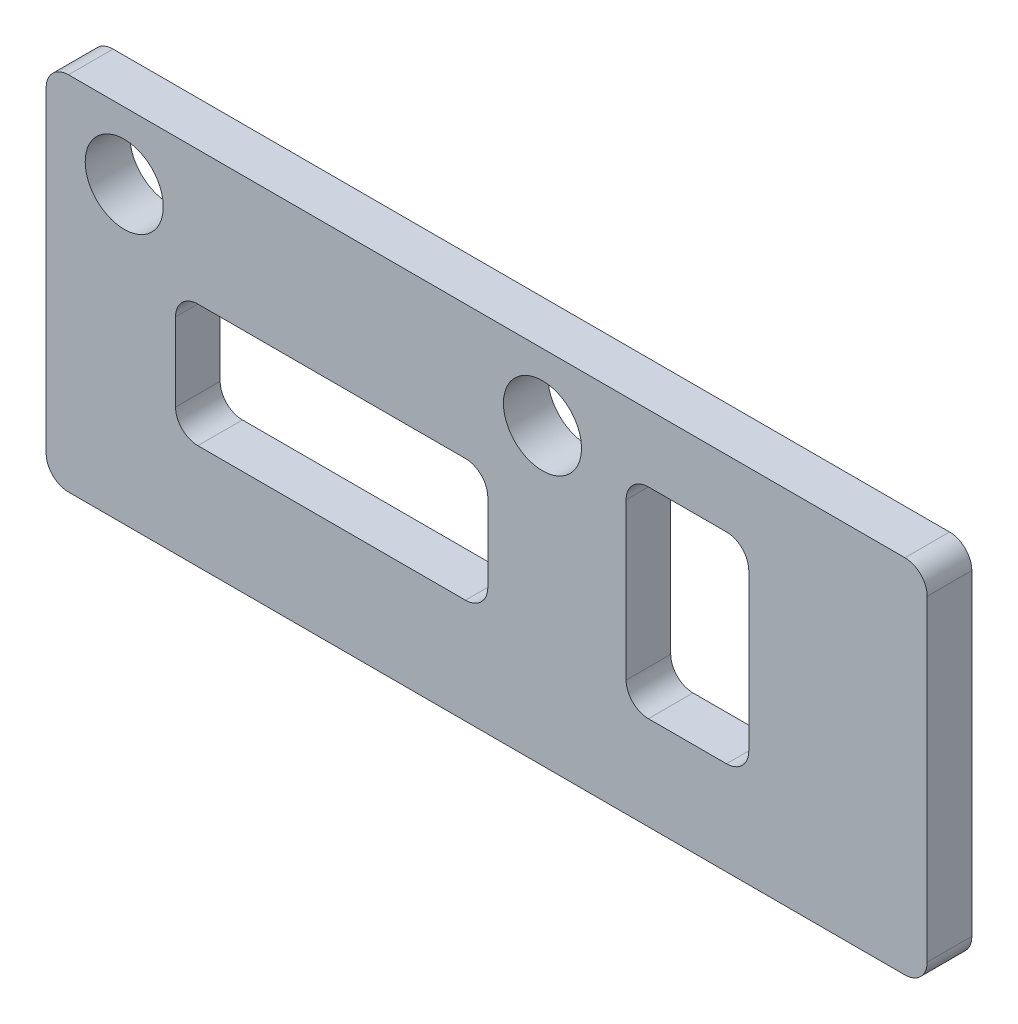
ISO-10303-21;
HEADER;
FILE_DESCRIPTION(('STEP AP214'),'2;1');
FILE_NAME('part.step','',(''),(''),'','','');
FILE_SCHEMA(('AUTOMOTIVE_DESIGN { 1 0 10303 214 1 1 1 1 }'));
ENDSEC;
DATA;
#1=APPLICATION_CONTEXT('core data for automotive mechanical design processes');
#2=APPLICATION_PROTOCOL_DEFINITION('international standard','automotive_design',2000,#1);
#3=PRODUCT_CONTEXT('',#1,'mechanical');
#4=PRODUCT('Part','Part','',(#3));
#5=PRODUCT_RELATED_PRODUCT_CATEGORY('part','',(#4));
#6=PRODUCT_DEFINITION_FORMATION('','',#4);
#7=PRODUCT_DEFINITION_CONTEXT('part definition',#1,'design');
#8=PRODUCT_DEFINITION('design','',#6,#7);
#9=PRODUCT_DEFINITION_SHAPE('','',#8);
#10=(LENGTH_UNIT() NAMED_UNIT(*) SI_UNIT(.MILLI.,.METRE.));
#11=(NAMED_UNIT(*) PLANE_ANGLE_UNIT() SI_UNIT($,.RADIAN.));
#12=(NAMED_UNIT(*) SI_UNIT($,.STERADIAN.) SOLID_ANGLE_UNIT());
#13=UNCERTAINTY_MEASURE_WITH_UNIT(LENGTH_MEASURE(1.E-05),#10,'distance_accuracy_value','');
#14=(GEOMETRIC_REPRESENTATION_CONTEXT(3) GLOBAL_UNCERTAINTY_ASSIGNED_CONTEXT((#13)) GLOBAL_UNIT_ASSIGNED_CONTEXT((#10,
#11,#12)) REPRESENTATION_CONTEXT('',''));
#15=CARTESIAN_POINT('',(0.,0.,0.));
#16=DIRECTION('',(0.,0.,1.));
#17=DIRECTION('',(1.,0.,0.));
#18=AXIS2_PLACEMENT_3D('',#15,#16,#17);
#19=CARTESIAN_POINT('',(-18.75,7.10000000000003,-2.));
#20=DIRECTION('',(0.,0.,1.));
#21=DIRECTION('',(1.,0.,0.));
#22=AXIS2_PLACEMENT_3D('',#19,#20,#21);
#23=CYLINDRICAL_SURFACE('',#22,0.99999999999999);
#24=CARTESIAN_POINT('',(-18.75,7.10000000000003,0.));
#25=DIRECTION('',(0.,0.,1.));
#26=DIRECTION('',(1.,0.,0.));
#27=AXIS2_PLACEMENT_3D('',#24,#25,#26);
#28=CIRCLE('',#27,0.99999999999999);
#29=CARTESIAN_POINT('',(-18.75,8.10000000000002,0.));
#30=VERTEX_POINT('',#29);
#31=CARTESIAN_POINT('',(-19.75,7.10000000000003,0.));
#32=VERTEX_POINT('',#31);
#33=EDGE_CURVE('E316',#30,#32,#28,.T.);
#34=ORIENTED_EDGE('',*,*,#33,.F.);
#35=DIRECTION('',(0.,0.,1.));
#36=VECTOR('',#35,1.);
#37=CARTESIAN_POINT('',(-18.75,8.10000000000002,-2.));
#38=LINE('',#37,#36);
#39=CARTESIAN_POINT('',(-18.75,8.10000000000002,-2.));
#40=VERTEX_POINT('',#39);
#41=EDGE_CURVE('E11',#40,#30,#38,.T.);
#42=ORIENTED_EDGE('',*,*,#41,.F.);
#43=CARTESIAN_POINT('',(-18.75,7.10000000000003,-2.));
#44=DIRECTION('',(0.,0.,1.));
#45=DIRECTION('',(1.,0.,0.));
#46=AXIS2_PLACEMENT_3D('',#43,#44,#45);
#47=CIRCLE('',#46,0.99999999999999);
#48=CARTESIAN_POINT('',(-19.75,7.10000000000003,-2.));
#49=VERTEX_POINT('',#48);
#50=EDGE_CURVE('E331',#40,#49,#47,.T.);
#51=ORIENTED_EDGE('',*,*,#50,.T.);
#52=DIRECTION('',(0.,0.,1.));
#53=VECTOR('',#52,1.);
#54=CARTESIAN_POINT('',(-19.75,7.10000000000003,-2.));
#55=LINE('',#54,#53);
#56=EDGE_CURVE('E36',#49,#32,#55,.T.);
#57=ORIENTED_EDGE('',*,*,#56,.T.);
#58=EDGE_LOOP('',(#34,#42,#51,#57));
#59=FACE_BOUND('',#58,.T.);
#60=ADVANCED_FACE('F33',(#59),#23,.T.);
#61=CARTESIAN_POINT('',(18.75,8.10000000000002,-2.));
#62=DIRECTION('',(0.,1.,0.));
#63=DIRECTION('',(0.,0.,1.));
#64=AXIS2_PLACEMENT_3D('',#61,#62,#63);
#65=PLANE('',#64);
#66=DIRECTION('',(-1.,0.,0.));
#67=VECTOR('',#66,1.);
#68=CARTESIAN_POINT('',(18.75,8.10000000000002,0.));
#69=LINE('',#68,#67);
#70=CARTESIAN_POINT('',(18.75,8.10000000000002,0.));
#71=VERTEX_POINT('',#70);
#72=EDGE_CURVE('E335',#71,#30,#69,.T.);
#73=ORIENTED_EDGE('',*,*,#72,.F.);
#74=DIRECTION('',(0.,0.,1.));
#75=VECTOR('',#74,1.);
#76=CARTESIAN_POINT('',(18.75,8.10000000000002,-2.));
#77=LINE('',#76,#75);
#78=CARTESIAN_POINT('',(18.75,8.10000000000002,-2.));
#79=VERTEX_POINT('',#78);
#80=EDGE_CURVE('E41',#79,#71,#77,.T.);
#81=ORIENTED_EDGE('',*,*,#80,.F.);
#82=DIRECTION('',(-1.,0.,0.));
#83=VECTOR('',#82,1.);
#84=CARTESIAN_POINT('',(18.75,8.10000000000002,-2.));
#85=LINE('',#84,#83);
#86=EDGE_CURVE('E353',#79,#40,#85,.T.);
#87=ORIENTED_EDGE('',*,*,#86,.T.);
#88=ORIENTED_EDGE('',*,*,#41,.T.);
#89=EDGE_LOOP('',(#73,#81,#87,#88));
#90=FACE_BOUND('',#89,.T.);
#91=ADVANCED_FACE('F400',(#90),#65,.T.);
#92=CARTESIAN_POINT('',(18.75,7.10000000000003,-2.));
#93=DIRECTION('',(0.,0.,1.));
#94=DIRECTION('',(1.,0.,0.));
#95=AXIS2_PLACEMENT_3D('',#92,#93,#94);
#96=CYLINDRICAL_SURFACE('',#95,0.99999999999999);
#97=CARTESIAN_POINT('',(18.75,7.10000000000003,0.));
#98=DIRECTION('',(0.,0.,1.));
#99=DIRECTION('',(1.,0.,0.));
#100=AXIS2_PLACEMENT_3D('',#97,#98,#99);
#101=CIRCLE('',#100,0.99999999999999);
#102=CARTESIAN_POINT('',(19.75,7.10000000000003,0.));
#103=VERTEX_POINT('',#102);
#104=EDGE_CURVE('E373',#103,#71,#101,.T.);
#105=ORIENTED_EDGE('',*,*,#104,.F.);
#106=DIRECTION('',(0.,0.,1.));
#107=VECTOR('',#106,1.);
#108=CARTESIAN_POINT('',(19.75,7.10000000000003,-2.));
#109=LINE('',#108,#107);
#110=CARTESIAN_POINT('',(19.75,7.10000000000003,-2.));
#111=VERTEX_POINT('',#110);
#112=EDGE_CURVE('E379',#111,#103,#109,.T.);
#113=ORIENTED_EDGE('',*,*,#112,.F.);
#114=CARTESIAN_POINT('',(18.75,7.10000000000003,-2.));
#115=DIRECTION('',(0.,0.,1.));
#116=DIRECTION('',(1.,0.,0.));
#117=AXIS2_PLACEMENT_3D('',#114,#115,#116);
#118=CIRCLE('',#117,0.99999999999999);
#119=EDGE_CURVE('E350',#111,#79,#118,.T.);
#120=ORIENTED_EDGE('',*,*,#119,.T.);
#121=ORIENTED_EDGE('',*,*,#80,.T.);
#122=EDGE_LOOP('',(#105,#113,#120,#121));
#123=FACE_BOUND('',#122,.T.);
#124=ADVANCED_FACE('F420',(#123),#96,.T.);
#125=CARTESIAN_POINT('',(19.75,-7.10000000000003,-2.));
#126=DIRECTION('',(1.,0.,0.));
#127=DIRECTION('',(0.,0.,-1.));
#128=AXIS2_PLACEMENT_3D('',#125,#126,#127);
#129=PLANE('',#128);
#130=DIRECTION('',(0.,1.,0.));
#131=VECTOR('',#130,1.);
#132=CARTESIAN_POINT('',(19.75,-7.10000000000003,0.));
#133=LINE('',#132,#131);
#134=CARTESIAN_POINT('',(19.75,-7.10000000000003,0.));
#135=VERTEX_POINT('',#134);
#136=EDGE_CURVE('E370',#135,#103,#133,.T.);
#137=ORIENTED_EDGE('',*,*,#136,.F.);
#138=DIRECTION('',(0.,0.,1.));
#139=VECTOR('',#138,1.);
#140=CARTESIAN_POINT('',(19.75,-7.10000000000003,-2.));
#141=LINE('',#140,#139);
#142=CARTESIAN_POINT('',(19.75,-7.10000000000003,-2.));
#143=VERTEX_POINT('',#142);
#144=EDGE_CURVE('E381',#143,#135,#141,.T.);
#145=ORIENTED_EDGE('',*,*,#144,.F.);
#146=DIRECTION('',(0.,1.,0.));
#147=VECTOR('',#146,1.);
#148=CARTESIAN_POINT('',(19.75,-7.10000000000003,-2.));
#149=LINE('',#148,#147);
#150=EDGE_CURVE('E347',#143,#111,#149,.T.);
#151=ORIENTED_EDGE('',*,*,#150,.T.);
#152=ORIENTED_EDGE('',*,*,#112,.T.);
#153=EDGE_LOOP('',(#137,#145,#151,#152));
#154=FACE_BOUND('',#153,.T.);
#155=ADVANCED_FACE('F418',(#154),#129,.T.);
#156=CARTESIAN_POINT('',(18.75,-7.10000000000003,-2.));
#157=DIRECTION('',(0.,0.,1.));
#158=DIRECTION('',(1.,0.,0.));
#159=AXIS2_PLACEMENT_3D('',#156,#157,#158);
#160=CYLINDRICAL_SURFACE('',#159,0.99999999999999);
#161=CARTESIAN_POINT('',(18.75,-7.10000000000003,0.));
#162=DIRECTION('',(0.,0.,1.));
#163=DIRECTION('',(1.,0.,0.));
#164=AXIS2_PLACEMENT_3D('',#161,#162,#163);
#165=CIRCLE('',#164,0.99999999999999);
#166=CARTESIAN_POINT('',(18.75,-8.10000000000002,0.));
#167=VERTEX_POINT('',#166);
#168=EDGE_CURVE('E367',#167,#135,#165,.T.);
#169=ORIENTED_EDGE('',*,*,#168,.F.);
#170=DIRECTION('',(0.,0.,1.));
#171=VECTOR('',#170,1.);
#172=CARTESIAN_POINT('',(18.75,-8.10000000000002,-2.));
#173=LINE('',#172,#171);
#174=CARTESIAN_POINT('',(18.75,-8.10000000000002,-2.));
#175=VERTEX_POINT('',#174);
#176=EDGE_CURVE('E383',#175,#167,#173,.T.);
#177=ORIENTED_EDGE('',*,*,#176,.F.);
#178=CARTESIAN_POINT('',(18.75,-7.10000000000003,-2.));
#179=DIRECTION('',(0.,0.,1.));
#180=DIRECTION('',(1.,0.,0.));
#181=AXIS2_PLACEMENT_3D('',#178,#179,#180);
#182=CIRCLE('',#181,0.99999999999999);
#183=EDGE_CURVE('E344',#175,#143,#182,.T.);
#184=ORIENTED_EDGE('',*,*,#183,.T.);
#185=ORIENTED_EDGE('',*,*,#144,.T.);
#186=EDGE_LOOP('',(#169,#177,#184,#185));
#187=FACE_BOUND('',#186,.T.);
#188=ADVANCED_FACE('F414',(#187),#160,.T.);
#189=CARTESIAN_POINT('',(-18.75,-8.10000000000002,-2.));
#190=DIRECTION('',(0.,-1.,0.));
#191=DIRECTION('',(0.,0.,-1.));
#192=AXIS2_PLACEMENT_3D('',#189,#190,#191);
#193=PLANE('',#192);
#194=DIRECTION('',(1.,0.,0.));
#195=VECTOR('',#194,1.);
#196=CARTESIAN_POINT('',(-18.75,-8.10000000000002,0.));
#197=LINE('',#196,#195);
#198=CARTESIAN_POINT('',(-18.75,-8.10000000000002,0.));
#199=VERTEX_POINT('',#198);
#200=EDGE_CURVE('E364',#199,#167,#197,.T.);
#201=ORIENTED_EDGE('',*,*,#200,.F.);
#202=DIRECTION('',(0.,0.,1.));
#203=VECTOR('',#202,1.);
#204=CARTESIAN_POINT('',(-18.75,-8.10000000000002,-2.));
#205=LINE('',#204,#203);
#206=CARTESIAN_POINT('',(-18.75,-8.10000000000002,-2.));
#207=VERTEX_POINT('',#206);
#208=EDGE_CURVE('E385',#207,#199,#205,.T.);
#209=ORIENTED_EDGE('',*,*,#208,.F.);
#210=DIRECTION('',(1.,0.,0.));
#211=VECTOR('',#210,1.);
#212=CARTESIAN_POINT('',(-18.75,-8.10000000000002,-2.));
#213=LINE('',#212,#211);
#214=EDGE_CURVE('E341',#207,#175,#213,.T.);
#215=ORIENTED_EDGE('',*,*,#214,.T.);
#216=ORIENTED_EDGE('',*,*,#176,.T.);
#217=EDGE_LOOP('',(#201,#209,#215,#216));
#218=FACE_BOUND('',#217,.T.);
#219=ADVANCED_FACE('F412',(#218),#193,.T.);
#220=CARTESIAN_POINT('',(-18.75,-7.10000000000003,-2.));
#221=DIRECTION('',(0.,0.,1.));
#222=DIRECTION('',(1.,0.,0.));
#223=AXIS2_PLACEMENT_3D('',#220,#221,#222);
#224=CYLINDRICAL_SURFACE('',#223,0.99999999999999);
#225=CARTESIAN_POINT('',(-18.75,-7.10000000000003,0.));
#226=DIRECTION('',(0.,0.,1.));
#227=DIRECTION('',(1.,0.,0.));
#228=AXIS2_PLACEMENT_3D('',#225,#226,#227);
#229=CIRCLE('',#228,0.99999999999999);
#230=CARTESIAN_POINT('',(-19.75,-7.10000000000003,0.));
#231=VERTEX_POINT('',#230);
#232=EDGE_CURVE('E361',#231,#199,#229,.T.);
#233=ORIENTED_EDGE('',*,*,#232,.F.);
#234=DIRECTION('',(0.,0.,1.));
#235=VECTOR('',#234,1.);
#236=CARTESIAN_POINT('',(-19.75,-7.10000000000003,-2.));
#237=LINE('',#236,#235);
#238=CARTESIAN_POINT('',(-19.75,-7.10000000000003,-2.));
#239=VERTEX_POINT('',#238);
#240=EDGE_CURVE('E386',#239,#231,#237,.T.);
#241=ORIENTED_EDGE('',*,*,#240,.F.);
#242=CARTESIAN_POINT('',(-18.75,-7.10000000000003,-2.));
#243=DIRECTION('',(0.,0.,1.));
#244=DIRECTION('',(1.,0.,0.));
#245=AXIS2_PLACEMENT_3D('',#242,#243,#244);
#246=CIRCLE('',#245,0.99999999999999);
#247=EDGE_CURVE('E338',#239,#207,#246,.T.);
#248=ORIENTED_EDGE('',*,*,#247,.T.);
#249=ORIENTED_EDGE('',*,*,#208,.T.);
#250=EDGE_LOOP('',(#233,#241,#248,#249));
#251=FACE_BOUND('',#250,.T.);
#252=ADVANCED_FACE('F408',(#251),#224,.T.);
#253=CARTESIAN_POINT('',(-19.75,7.10000000000003,-2.));
#254=DIRECTION('',(-1.,0.,0.));
#255=DIRECTION('',(0.,0.,1.));
#256=AXIS2_PLACEMENT_3D('',#253,#254,#255);
#257=PLANE('',#256);
#258=DIRECTION('',(0.,-1.,0.));
#259=VECTOR('',#258,1.);
#260=CARTESIAN_POINT('',(-19.75,7.10000000000003,0.));
#261=LINE('',#260,#259);
#262=EDGE_CURVE('E358',#32,#231,#261,.T.);
#263=ORIENTED_EDGE('',*,*,#262,.F.);
#264=ORIENTED_EDGE('',*,*,#56,.F.);
#265=DIRECTION('',(0.,-1.,0.));
#266=VECTOR('',#265,1.);
#267=CARTESIAN_POINT('',(-19.75,7.10000000000003,-2.));
#268=LINE('',#267,#266);
#269=EDGE_CURVE('E334',#49,#239,#268,.T.);
#270=ORIENTED_EDGE('',*,*,#269,.T.);
#271=ORIENTED_EDGE('',*,*,#240,.T.);
#272=EDGE_LOOP('',(#263,#264,#270,#271));
#273=FACE_BOUND('',#272,.T.);
#274=ADVANCED_FACE('F394',(#273),#257,.T.);
#275=CARTESIAN_POINT('',(-18.75,7.10000000000003,-2.));
#276=DIRECTION('',(0.,0.,1.));
#277=DIRECTION('',(1.,0.,0.));
#278=AXIS2_PLACEMENT_3D('',#275,#276,#277);
#279=PLANE('',#278);
#280=CARTESIAN_POINT('',(2.49999999999997,5.10000000000002,-2.));
#281=DIRECTION('',(0.,0.,1.));
#282=DIRECTION('',(-1.,0.,0.));
#283=AXIS2_PLACEMENT_3D('',#280,#281,#282);
#284=CIRCLE('',#283,1.75);
#285=CARTESIAN_POINT('',(0.749999999999975,5.10000000000002,-2.));
#286=VERTEX_POINT('',#285);
#287=EDGE_CURVE('E677',#286,#286,#284,.T.);
#288=ORIENTED_EDGE('',*,*,#287,.T.);
#289=EDGE_LOOP('',(#288));
#290=FACE_BOUND('',#289,.T.);
#291=CARTESIAN_POINT('',(-16.2499999999999,5.10000000000002,-2.));
#292=DIRECTION('',(0.,0.,1.));
#293=DIRECTION('',(-1.,0.,0.));
#294=AXIS2_PLACEMENT_3D('',#291,#292,#293);
#295=CIRCLE('',#294,1.75);
#296=CARTESIAN_POINT('',(-17.9999999999999,5.10000000000002,-2.));
#297=VERTEX_POINT('',#296);
#298=EDGE_CURVE('E237',#297,#297,#295,.T.);
#299=ORIENTED_EDGE('',*,*,#298,.T.);
#300=EDGE_LOOP('',(#299));
#301=FACE_BOUND('',#300,.T.);
#302=DIRECTION('',(-1.,0.,0.));
#303=VECTOR('',#302,1.);
#304=CARTESIAN_POINT('',(-12.95,2.10000000000001,-2.));
#305=LINE('',#304,#303);
#306=CARTESIAN_POINT('',(-0.949999999999918,2.10000000000001,-2.));
#307=VERTEX_POINT('',#306);
#308=CARTESIAN_POINT('',(-12.95,2.10000000000001,-2.));
#309=VERTEX_POINT('',#308);
#310=EDGE_CURVE('E202',#307,#309,#305,.T.);
#311=ORIENTED_EDGE('',*,*,#310,.T.);
#312=CARTESIAN_POINT('',(-12.95,1.10000000000002,-2.));
#313=DIRECTION('',(0.,0.,1.));
#314=DIRECTION('',(-1.,0.,0.));
#315=AXIS2_PLACEMENT_3D('',#312,#313,#314);
#316=CIRCLE('',#315,0.999999999999989);
#317=CARTESIAN_POINT('',(-13.95,1.10000000000002,-2.));
#318=VERTEX_POINT('',#317);
#319=EDGE_CURVE('E196',#309,#318,#316,.T.);
#320=ORIENTED_EDGE('',*,*,#319,.T.);
#321=DIRECTION('',(0.,-1.,0.));
#322=VECTOR('',#321,1.);
#323=CARTESIAN_POINT('',(-13.95,-2.40000000000003,-2.));
#324=LINE('',#323,#322);
#325=CARTESIAN_POINT('',(-13.95,-2.40000000000003,-2.));
#326=VERTEX_POINT('',#325);
#327=EDGE_CURVE('E205',#318,#326,#324,.T.);
#328=ORIENTED_EDGE('',*,*,#327,.T.);
#329=CARTESIAN_POINT('',(-12.95,-2.40000000000003,-2.));
#330=DIRECTION('',(0.,0.,1.));
#331=DIRECTION('',(-1.,0.,0.));
#332=AXIS2_PLACEMENT_3D('',#329,#330,#331);
#333=CIRCLE('',#332,0.999999999999989);
#334=CARTESIAN_POINT('',(-12.95,-3.40000000000002,-2.));
#335=VERTEX_POINT('',#334);
#336=EDGE_CURVE('E49',#326,#335,#333,.T.);
#337=ORIENTED_EDGE('',*,*,#336,.T.);
#338=DIRECTION('',(1.,0.,0.));
#339=VECTOR('',#338,1.);
#340=CARTESIAN_POINT('',(-0.949999999999917,-3.40000000000002,-2.));
#341=LINE('',#340,#339);
#342=CARTESIAN_POINT('',(-0.949999999999917,-3.40000000000002,-2.));
#343=VERTEX_POINT('',#342);
#344=EDGE_CURVE('E223',#335,#343,#341,.T.);
#345=ORIENTED_EDGE('',*,*,#344,.T.);
#346=CARTESIAN_POINT('',(-0.949999999999917,-2.40000000000003,-2.));
#347=DIRECTION('',(0.,0.,1.));
#348=DIRECTION('',(-1.,0.,0.));
#349=AXIS2_PLACEMENT_3D('',#346,#347,#348);
#350=CIRCLE('',#349,0.999999999999989);
#351=CARTESIAN_POINT('',(0.0500000000000713,-2.40000000000003,-2.));
#352=VERTEX_POINT('',#351);
#353=EDGE_CURVE('E226',#343,#352,#350,.T.);
#354=ORIENTED_EDGE('',*,*,#353,.T.);
#355=DIRECTION('',(0.,1.,0.));
#356=VECTOR('',#355,1.);
#357=CARTESIAN_POINT('',(0.0500000000000708,1.10000000000002,-2.));
#358=LINE('',#357,#356);
#359=CARTESIAN_POINT('',(0.0500000000000708,1.10000000000002,-2.));
#360=VERTEX_POINT('',#359);
#361=EDGE_CURVE('E229',#352,#360,#358,.T.);
#362=ORIENTED_EDGE('',*,*,#361,.T.);
#363=CARTESIAN_POINT('',(-0.949999999999918,1.10000000000002,-2.));
#364=DIRECTION('',(0.,0.,1.));
#365=DIRECTION('',(-1.,0.,0.));
#366=AXIS2_PLACEMENT_3D('',#363,#364,#365);
#367=CIRCLE('',#366,0.999999999999989);
#368=EDGE_CURVE('E232',#360,#307,#367,.T.);
#369=ORIENTED_EDGE('',*,*,#368,.T.);
#370=EDGE_LOOP('',(#311,#320,#328,#337,#345,#354,#362,#369));
#371=FACE_BOUND('',#370,.T.);
#372=DIRECTION('',(-1.,0.,0.));
#373=VECTOR('',#372,1.);
#374=CARTESIAN_POINT('',(7.24999999999997,5.10000000000001,-2.));
#375=LINE('',#374,#373);
#376=CARTESIAN_POINT('',(10.75,5.10000000000001,-2.));
#377=VERTEX_POINT('',#376);
#378=CARTESIAN_POINT('',(7.24999999999997,5.10000000000001,-2.));
#379=VERTEX_POINT('',#378);
#380=EDGE_CURVE('E289',#377,#379,#375,.T.);
#381=ORIENTED_EDGE('',*,*,#380,.T.);
#382=CARTESIAN_POINT('',(7.24999999999997,4.10000000000002,-2.));
#383=DIRECTION('',(0.,0.,1.));
#384=DIRECTION('',(-1.,0.,0.));
#385=AXIS2_PLACEMENT_3D('',#382,#383,#384);
#386=CIRCLE('',#385,0.999999999999989);
#387=CARTESIAN_POINT('',(6.24999999999998,4.10000000000002,-2.));
#388=VERTEX_POINT('',#387);
#389=EDGE_CURVE('E267',#379,#388,#386,.T.);
#390=ORIENTED_EDGE('',*,*,#389,.T.);
#391=DIRECTION('',(0.,-1.,0.));
#392=VECTOR('',#391,1.);
#393=CARTESIAN_POINT('',(6.24999999999998,-2.90000000000003,-2.));
#394=LINE('',#393,#392);
#395=CARTESIAN_POINT('',(6.24999999999998,-2.90000000000003,-2.));
#396=VERTEX_POINT('',#395);
#397=EDGE_CURVE('E270',#388,#396,#394,.T.);
#398=ORIENTED_EDGE('',*,*,#397,.T.);
#399=CARTESIAN_POINT('',(7.24999999999997,-2.90000000000003,-2.));
#400=DIRECTION('',(0.,0.,1.));
#401=DIRECTION('',(-1.,0.,0.));
#402=AXIS2_PLACEMENT_3D('',#399,#400,#401);
#403=CIRCLE('',#402,0.999999999999989);
#404=CARTESIAN_POINT('',(7.24999999999997,-3.90000000000001,-2.));
#405=VERTEX_POINT('',#404);
#406=EDGE_CURVE('E274',#396,#405,#403,.T.);
#407=ORIENTED_EDGE('',*,*,#406,.T.);
#408=DIRECTION('',(1.,0.,0.));
#409=VECTOR('',#408,1.);
#410=CARTESIAN_POINT('',(10.75,-3.90000000000001,-2.));
#411=LINE('',#410,#409);
#412=CARTESIAN_POINT('',(10.75,-3.90000000000002,-2.));
#413=VERTEX_POINT('',#412);
#414=EDGE_CURVE('E277',#405,#413,#411,.T.);
#415=ORIENTED_EDGE('',*,*,#414,.T.);
#416=CARTESIAN_POINT('',(10.75,-2.90000000000003,-2.));
#417=DIRECTION('',(0.,0.,1.));
#418=DIRECTION('',(-1.,0.,0.));
#419=AXIS2_PLACEMENT_3D('',#416,#417,#418);
#420=CIRCLE('',#419,0.99999999999999);
#421=CARTESIAN_POINT('',(11.75,-2.90000000000003,-2.));
#422=VERTEX_POINT('',#421);
#423=EDGE_CURVE('E280',#413,#422,#420,.T.);
#424=ORIENTED_EDGE('',*,*,#423,.T.);
#425=DIRECTION('',(0.,1.,0.));
#426=VECTOR('',#425,1.);
#427=CARTESIAN_POINT('',(11.75,4.10000000000002,-2.));
#428=LINE('',#427,#426);
#429=CARTESIAN_POINT('',(11.75,4.10000000000002,-2.));
#430=VERTEX_POINT('',#429);
#431=EDGE_CURVE('E283',#422,#430,#428,.T.);
#432=ORIENTED_EDGE('',*,*,#431,.T.);
#433=CARTESIAN_POINT('',(10.75,4.10000000000002,-2.));
#434=DIRECTION('',(0.,0.,1.));
#435=DIRECTION('',(-1.,0.,0.));
#436=AXIS2_PLACEMENT_3D('',#433,#434,#435);
#437=CIRCLE('',#436,0.999999999999989);
#438=EDGE_CURVE('E286',#430,#377,#437,.T.);
#439=ORIENTED_EDGE('',*,*,#438,.T.);
#440=EDGE_LOOP('',(#381,#390,#398,#407,#415,#424,#432,#439));
#441=FACE_BOUND('',#440,.T.);
#442=ORIENTED_EDGE('',*,*,#50,.F.);
#443=ORIENTED_EDGE('',*,*,#86,.F.);
#444=ORIENTED_EDGE('',*,*,#119,.F.);
#445=ORIENTED_EDGE('',*,*,#150,.F.);
#446=ORIENTED_EDGE('',*,*,#183,.F.);
#447=ORIENTED_EDGE('',*,*,#214,.F.);
#448=ORIENTED_EDGE('',*,*,#247,.F.);
#449=ORIENTED_EDGE('',*,*,#269,.F.);
#450=EDGE_LOOP('',(#442,#443,#444,#445,#446,#447,#448,#449));
#451=FACE_BOUND('',#450,.T.);
#452=ADVANCED_FACE('F209',(#290,#301,#371,#441,#451),#279,.F.);
#453=CARTESIAN_POINT('',(-18.75,7.10000000000003,0.));
#454=DIRECTION('',(0.,0.,1.));
#455=DIRECTION('',(1.,0.,0.));
#456=AXIS2_PLACEMENT_3D('',#453,#454,#455);
#457=PLANE('',#456);
#458=CARTESIAN_POINT('',(2.49999999999997,5.10000000000002,0.));
#459=DIRECTION('',(0.,0.,1.));
#460=DIRECTION('',(-1.,0.,0.));
#461=AXIS2_PLACEMENT_3D('',#458,#459,#460);
#462=CIRCLE('',#461,1.75);
#463=CARTESIAN_POINT('',(0.749999999999975,5.10000000000002,0.));
#464=VERTEX_POINT('',#463);
#465=EDGE_CURVE('E680',#464,#464,#462,.T.);
#466=ORIENTED_EDGE('',*,*,#465,.F.);
#467=EDGE_LOOP('',(#466));
#468=FACE_BOUND('',#467,.T.);
#469=CARTESIAN_POINT('',(-16.2499999999999,5.10000000000002,0.));
#470=DIRECTION('',(0.,0.,1.));
#471=DIRECTION('',(-1.,0.,0.));
#472=AXIS2_PLACEMENT_3D('',#469,#470,#471);
#473=CIRCLE('',#472,1.75);
#474=CARTESIAN_POINT('',(-17.9999999999999,5.10000000000002,0.));
#475=VERTEX_POINT('',#474);
#476=EDGE_CURVE('E219',#475,#475,#473,.T.);
#477=ORIENTED_EDGE('',*,*,#476,.F.);
#478=EDGE_LOOP('',(#477));
#479=FACE_BOUND('',#478,.T.);
#480=CARTESIAN_POINT('',(-12.95,1.10000000000002,0.));
#481=DIRECTION('',(0.,0.,1.));
#482=DIRECTION('',(-1.,0.,0.));
#483=AXIS2_PLACEMENT_3D('',#480,#481,#482);
#484=CIRCLE('',#483,0.999999999999989);
#485=CARTESIAN_POINT('',(-12.95,2.10000000000001,0.));
#486=VERTEX_POINT('',#485);
#487=CARTESIAN_POINT('',(-13.95,1.10000000000002,0.));
#488=VERTEX_POINT('',#487);
#489=EDGE_CURVE('E57',#486,#488,#484,.T.);
#490=ORIENTED_EDGE('',*,*,#489,.F.);
#491=DIRECTION('',(-1.,0.,0.));
#492=VECTOR('',#491,1.);
#493=CARTESIAN_POINT('',(-12.95,2.10000000000001,0.));
#494=LINE('',#493,#492);
#495=CARTESIAN_POINT('',(-0.949999999999918,2.10000000000001,0.));
#496=VERTEX_POINT('',#495);
#497=EDGE_CURVE('E213',#496,#486,#494,.T.);
#498=ORIENTED_EDGE('',*,*,#497,.F.);
#499=CARTESIAN_POINT('',(-0.949999999999918,1.10000000000002,0.));
#500=DIRECTION('',(0.,0.,1.));
#501=DIRECTION('',(-1.,0.,0.));
#502=AXIS2_PLACEMENT_3D('',#499,#500,#501);
#503=CIRCLE('',#502,0.999999999999989);
#504=CARTESIAN_POINT('',(0.0500000000000708,1.10000000000002,0.));
#505=VERTEX_POINT('',#504);
#506=EDGE_CURVE('E216',#505,#496,#503,.T.);
#507=ORIENTED_EDGE('',*,*,#506,.F.);
#508=DIRECTION('',(0.,1.,0.));
#509=VECTOR('',#508,1.);
#510=CARTESIAN_POINT('',(0.0500000000000708,1.10000000000002,0.));
#511=LINE('',#510,#509);
#512=CARTESIAN_POINT('',(0.0500000000000713,-2.40000000000003,0.));
#513=VERTEX_POINT('',#512);
#514=EDGE_CURVE('E248',#513,#505,#511,.T.);
#515=ORIENTED_EDGE('',*,*,#514,.F.);
#516=CARTESIAN_POINT('',(-0.949999999999917,-2.40000000000003,0.));
#517=DIRECTION('',(0.,0.,1.));
#518=DIRECTION('',(-1.,0.,0.));
#519=AXIS2_PLACEMENT_3D('',#516,#517,#518);
#520=CIRCLE('',#519,0.999999999999989);
#521=CARTESIAN_POINT('',(-0.949999999999917,-3.40000000000002,0.));
#522=VERTEX_POINT('',#521);
#523=EDGE_CURVE('E245',#522,#513,#520,.T.);
#524=ORIENTED_EDGE('',*,*,#523,.F.);
#525=DIRECTION('',(1.,0.,0.));
#526=VECTOR('',#525,1.);
#527=CARTESIAN_POINT('',(-0.949999999999917,-3.40000000000002,0.));
#528=LINE('',#527,#526);
#529=CARTESIAN_POINT('',(-12.95,-3.40000000000002,0.));
#530=VERTEX_POINT('',#529);
#531=EDGE_CURVE('E242',#530,#522,#528,.T.);
#532=ORIENTED_EDGE('',*,*,#531,.F.);
#533=CARTESIAN_POINT('',(-12.95,-2.40000000000003,0.));
#534=DIRECTION('',(0.,0.,1.));
#535=DIRECTION('',(-1.,0.,0.));
#536=AXIS2_PLACEMENT_3D('',#533,#534,#535);
#537=CIRCLE('',#536,0.999999999999989);
#538=CARTESIAN_POINT('',(-13.95,-2.40000000000003,0.));
#539=VERTEX_POINT('',#538);
#540=EDGE_CURVE('E239',#539,#530,#537,.T.);
#541=ORIENTED_EDGE('',*,*,#540,.F.);
#542=DIRECTION('',(0.,-1.,0.));
#543=VECTOR('',#542,1.);
#544=CARTESIAN_POINT('',(-13.95,-2.40000000000003,0.));
#545=LINE('',#544,#543);
#546=EDGE_CURVE('E236',#488,#539,#545,.T.);
#547=ORIENTED_EDGE('',*,*,#546,.F.);
#548=EDGE_LOOP('',(#490,#498,#507,#515,#524,#532,#541,#547));
#549=FACE_BOUND('',#548,.T.);
#550=CARTESIAN_POINT('',(7.24999999999997,4.10000000000002,0.));
#551=DIRECTION('',(0.,0.,1.));
#552=DIRECTION('',(-1.,0.,0.));
#553=AXIS2_PLACEMENT_3D('',#550,#551,#552);
#554=CIRCLE('',#553,0.999999999999989);
#555=CARTESIAN_POINT('',(7.24999999999997,5.10000000000001,0.));
#556=VERTEX_POINT('',#555);
#557=CARTESIAN_POINT('',(6.24999999999998,4.10000000000002,0.));
#558=VERTEX_POINT('',#557);
#559=EDGE_CURVE('E255',#556,#558,#554,.T.);
#560=ORIENTED_EDGE('',*,*,#559,.F.);
#561=DIRECTION('',(-1.,0.,0.));
#562=VECTOR('',#561,1.);
#563=CARTESIAN_POINT('',(7.24999999999997,5.10000000000001,0.));
#564=LINE('',#563,#562);
#565=CARTESIAN_POINT('',(10.75,5.10000000000001,0.));
#566=VERTEX_POINT('',#565);
#567=EDGE_CURVE('E271',#566,#556,#564,.T.);
#568=ORIENTED_EDGE('',*,*,#567,.F.);
#569=CARTESIAN_POINT('',(10.75,4.10000000000002,0.));
#570=DIRECTION('',(0.,0.,1.));
#571=DIRECTION('',(-1.,0.,0.));
#572=AXIS2_PLACEMENT_3D('',#569,#570,#571);
#573=CIRCLE('',#572,0.999999999999989);
#574=CARTESIAN_POINT('',(11.75,4.10000000000002,0.));
#575=VERTEX_POINT('',#574);
#576=EDGE_CURVE('E309',#575,#566,#573,.T.);
#577=ORIENTED_EDGE('',*,*,#576,.F.);
#578=DIRECTION('',(0.,1.,0.));
#579=VECTOR('',#578,1.);
#580=CARTESIAN_POINT('',(11.75,4.10000000000002,0.));
#581=LINE('',#580,#579);
#582=CARTESIAN_POINT('',(11.75,-2.90000000000003,0.));
#583=VERTEX_POINT('',#582);
#584=EDGE_CURVE('E306',#583,#575,#581,.T.);
#585=ORIENTED_EDGE('',*,*,#584,.F.);
#586=CARTESIAN_POINT('',(10.75,-2.90000000000003,0.));
#587=DIRECTION('',(0.,0.,1.));
#588=DIRECTION('',(-1.,0.,0.));
#589=AXIS2_PLACEMENT_3D('',#586,#587,#588);
#590=CIRCLE('',#589,0.99999999999999);
#591=CARTESIAN_POINT('',(10.75,-3.90000000000002,0.));
#592=VERTEX_POINT('',#591);
#593=EDGE_CURVE('E303',#592,#583,#590,.T.);
#594=ORIENTED_EDGE('',*,*,#593,.F.);
#595=DIRECTION('',(1.,0.,0.));
#596=VECTOR('',#595,1.);
#597=CARTESIAN_POINT('',(10.75,-3.90000000000001,0.));
#598=LINE('',#597,#596);
#599=CARTESIAN_POINT('',(7.24999999999997,-3.90000000000001,0.));
#600=VERTEX_POINT('',#599);
#601=EDGE_CURVE('E300',#600,#592,#598,.T.);
#602=ORIENTED_EDGE('',*,*,#601,.F.);
#603=CARTESIAN_POINT('',(7.24999999999997,-2.90000000000003,0.));
#604=DIRECTION('',(0.,0.,1.));
#605=DIRECTION('',(-1.,0.,0.));
#606=AXIS2_PLACEMENT_3D('',#603,#604,#605);
#607=CIRCLE('',#606,0.999999999999989);
#608=CARTESIAN_POINT('',(6.24999999999998,-2.90000000000003,0.));
#609=VERTEX_POINT('',#608);
#610=EDGE_CURVE('E297',#609,#600,#607,.T.);
#611=ORIENTED_EDGE('',*,*,#610,.F.);
#612=DIRECTION('',(0.,-1.,0.));
#613=VECTOR('',#612,1.);
#614=CARTESIAN_POINT('',(6.24999999999998,-2.90000000000003,0.));
#615=LINE('',#614,#613);
#616=EDGE_CURVE('E294',#558,#609,#615,.T.);
#617=ORIENTED_EDGE('',*,*,#616,.F.);
#618=EDGE_LOOP('',(#560,#568,#577,#585,#594,#602,#611,#617));
#619=FACE_BOUND('',#618,.T.);
#620=ORIENTED_EDGE('',*,*,#33,.T.);
#621=ORIENTED_EDGE('',*,*,#262,.T.);
#622=ORIENTED_EDGE('',*,*,#232,.T.);
#623=ORIENTED_EDGE('',*,*,#200,.T.);
#624=ORIENTED_EDGE('',*,*,#168,.T.);
#625=ORIENTED_EDGE('',*,*,#136,.T.);
#626=ORIENTED_EDGE('',*,*,#104,.T.);
#627=ORIENTED_EDGE('',*,*,#72,.T.);
#628=EDGE_LOOP('',(#620,#621,#622,#623,#624,#625,#626,#627));
#629=FACE_BOUND('',#628,.T.);
#630=ADVANCED_FACE('F396',(#468,#479,#549,#619,#629),#457,.T.);
#631=CARTESIAN_POINT('',(7.24999999999997,4.10000000000002,-2.));
#632=DIRECTION('',(0.,0.,1.));
#633=DIRECTION('',(1.,0.,0.));
#634=AXIS2_PLACEMENT_3D('',#631,#632,#633);
#635=CYLINDRICAL_SURFACE('',#634,0.999999999999989);
#636=ORIENTED_EDGE('',*,*,#559,.T.);
#637=DIRECTION('',(0.,0.,1.));
#638=VECTOR('',#637,1.);
#639=CARTESIAN_POINT('',(6.24999999999998,4.10000000000002,-2.));
#640=LINE('',#639,#638);
#641=EDGE_CURVE('E292',#388,#558,#640,.T.);
#642=ORIENTED_EDGE('',*,*,#641,.F.);
#643=ORIENTED_EDGE('',*,*,#389,.F.);
#644=DIRECTION('',(0.,0.,1.));
#645=VECTOR('',#644,1.);
#646=CARTESIAN_POINT('',(7.24999999999997,5.10000000000001,-2.));
#647=LINE('',#646,#645);
#648=EDGE_CURVE('E314',#379,#556,#647,.T.);
#649=ORIENTED_EDGE('',*,*,#648,.T.);
#650=EDGE_LOOP('',(#636,#642,#643,#649));
#651=FACE_BOUND('',#650,.T.);
#652=ADVANCED_FACE('F495',(#651),#635,.F.);
#653=CARTESIAN_POINT('',(7.24999999999997,5.10000000000001,-2.));
#654=DIRECTION('',(0.,1.,0.));
#655=DIRECTION('',(0.,0.,1.));
#656=AXIS2_PLACEMENT_3D('',#653,#654,#655);
#657=PLANE('',#656);
#658=ORIENTED_EDGE('',*,*,#567,.T.);
#659=ORIENTED_EDGE('',*,*,#648,.F.);
#660=ORIENTED_EDGE('',*,*,#380,.F.);
#661=DIRECTION('',(0.,0.,1.));
#662=VECTOR('',#661,1.);
#663=CARTESIAN_POINT('',(10.75,5.10000000000001,-2.));
#664=LINE('',#663,#662);
#665=EDGE_CURVE('E317',#377,#566,#664,.T.);
#666=ORIENTED_EDGE('',*,*,#665,.T.);
#667=EDGE_LOOP('',(#658,#659,#660,#666));
#668=FACE_BOUND('',#667,.T.);
#669=ADVANCED_FACE('F505',(#668),#657,.F.);
#670=CARTESIAN_POINT('',(10.75,4.10000000000002,-2.));
#671=DIRECTION('',(0.,0.,1.));
#672=DIRECTION('',(1.,0.,0.));
#673=AXIS2_PLACEMENT_3D('',#670,#671,#672);
#674=CYLINDRICAL_SURFACE('',#673,0.999999999999989);
#675=ORIENTED_EDGE('',*,*,#576,.T.);
#676=ORIENTED_EDGE('',*,*,#665,.F.);
#677=ORIENTED_EDGE('',*,*,#438,.F.);
#678=DIRECTION('',(0.,0.,1.));
#679=VECTOR('',#678,1.);
#680=CARTESIAN_POINT('',(11.75,4.10000000000002,-2.));
#681=LINE('',#680,#679);
#682=EDGE_CURVE('E319',#430,#575,#681,.T.);
#683=ORIENTED_EDGE('',*,*,#682,.T.);
#684=EDGE_LOOP('',(#675,#676,#677,#683));
#685=FACE_BOUND('',#684,.T.);
#686=ADVANCED_FACE('F515',(#685),#674,.F.);
#687=CARTESIAN_POINT('',(11.75,4.10000000000002,-2.));
#688=DIRECTION('',(1.,0.,0.));
#689=DIRECTION('',(0.,1.,0.));
#690=AXIS2_PLACEMENT_3D('',#687,#688,#689);
#691=PLANE('',#690);
#692=ORIENTED_EDGE('',*,*,#584,.T.);
#693=ORIENTED_EDGE('',*,*,#682,.F.);
#694=ORIENTED_EDGE('',*,*,#431,.F.);
#695=DIRECTION('',(0.,0.,1.));
#696=VECTOR('',#695,1.);
#697=CARTESIAN_POINT('',(11.75,-2.90000000000003,-2.));
#698=LINE('',#697,#696);
#699=EDGE_CURVE('E321',#422,#583,#698,.T.);
#700=ORIENTED_EDGE('',*,*,#699,.T.);
#701=EDGE_LOOP('',(#692,#693,#694,#700));
#702=FACE_BOUND('',#701,.T.);
#703=ADVANCED_FACE('F525',(#702),#691,.F.);
#704=CARTESIAN_POINT('',(10.75,-2.90000000000003,-2.));
#705=DIRECTION('',(0.,0.,1.));
#706=DIRECTION('',(1.,0.,0.));
#707=AXIS2_PLACEMENT_3D('',#704,#705,#706);
#708=CYLINDRICAL_SURFACE('',#707,0.99999999999999);
#709=ORIENTED_EDGE('',*,*,#593,.T.);
#710=ORIENTED_EDGE('',*,*,#699,.F.);
#711=ORIENTED_EDGE('',*,*,#423,.F.);
#712=DIRECTION('',(0.,0.,1.));
#713=VECTOR('',#712,1.);
#714=CARTESIAN_POINT('',(10.75,-3.90000000000002,-2.));
#715=LINE('',#714,#713);
#716=EDGE_CURVE('E323',#413,#592,#715,.T.);
#717=ORIENTED_EDGE('',*,*,#716,.T.);
#718=EDGE_LOOP('',(#709,#710,#711,#717));
#719=FACE_BOUND('',#718,.T.);
#720=ADVANCED_FACE('F535',(#719),#708,.F.);
#721=CARTESIAN_POINT('',(10.75,-3.90000000000001,-2.));
#722=DIRECTION('',(0.,-1.,0.));
#723=DIRECTION('',(0.,0.,-1.));
#724=AXIS2_PLACEMENT_3D('',#721,#722,#723);
#725=PLANE('',#724);
#726=ORIENTED_EDGE('',*,*,#601,.T.);
#727=ORIENTED_EDGE('',*,*,#716,.F.);
#728=ORIENTED_EDGE('',*,*,#414,.F.);
#729=DIRECTION('',(0.,0.,1.));
#730=VECTOR('',#729,1.);
#731=CARTESIAN_POINT('',(7.24999999999997,-3.90000000000001,-2.));
#732=LINE('',#731,#730);
#733=EDGE_CURVE('E325',#405,#600,#732,.T.);
#734=ORIENTED_EDGE('',*,*,#733,.T.);
#735=EDGE_LOOP('',(#726,#727,#728,#734));
#736=FACE_BOUND('',#735,.T.);
#737=ADVANCED_FACE('F545',(#736),#725,.F.);
#738=CARTESIAN_POINT('',(7.24999999999997,-2.90000000000003,-2.));
#739=DIRECTION('',(0.,0.,1.));
#740=DIRECTION('',(1.,0.,0.));
#741=AXIS2_PLACEMENT_3D('',#738,#739,#740);
#742=CYLINDRICAL_SURFACE('',#741,0.999999999999989);
#743=ORIENTED_EDGE('',*,*,#610,.T.);
#744=ORIENTED_EDGE('',*,*,#733,.F.);
#745=ORIENTED_EDGE('',*,*,#406,.F.);
#746=DIRECTION('',(0.,0.,1.));
#747=VECTOR('',#746,1.);
#748=CARTESIAN_POINT('',(6.24999999999998,-2.90000000000003,-2.));
#749=LINE('',#748,#747);
#750=EDGE_CURVE('E327',#396,#609,#749,.T.);
#751=ORIENTED_EDGE('',*,*,#750,.T.);
#752=EDGE_LOOP('',(#743,#744,#745,#751));
#753=FACE_BOUND('',#752,.T.);
#754=ADVANCED_FACE('F555',(#753),#742,.F.);
#755=CARTESIAN_POINT('',(6.24999999999998,-2.90000000000003,-2.));
#756=DIRECTION('',(-1.,0.,0.));
#757=DIRECTION('',(0.,0.,1.));
#758=AXIS2_PLACEMENT_3D('',#755,#756,#757);
#759=PLANE('',#758);
#760=ORIENTED_EDGE('',*,*,#616,.T.);
#761=ORIENTED_EDGE('',*,*,#750,.F.);
#762=ORIENTED_EDGE('',*,*,#397,.F.);
#763=ORIENTED_EDGE('',*,*,#641,.T.);
#764=EDGE_LOOP('',(#760,#761,#762,#763));
#765=FACE_BOUND('',#764,.T.);
#766=ADVANCED_FACE('F565',(#765),#759,.F.);
#767=CARTESIAN_POINT('',(-12.95,1.10000000000002,-2.));
#768=DIRECTION('',(0.,0.,1.));
#769=DIRECTION('',(1.,0.,0.));
#770=AXIS2_PLACEMENT_3D('',#767,#768,#769);
#771=CYLINDRICAL_SURFACE('',#770,0.999999999999989);
#772=ORIENTED_EDGE('',*,*,#489,.T.);
#773=DIRECTION('',(0.,0.,1.));
#774=VECTOR('',#773,1.);
#775=CARTESIAN_POINT('',(-13.95,1.10000000000002,-2.));
#776=LINE('',#775,#774);
#777=EDGE_CURVE('E192',#318,#488,#776,.T.);
#778=ORIENTED_EDGE('',*,*,#777,.F.);
#779=ORIENTED_EDGE('',*,*,#319,.F.);
#780=DIRECTION('',(0.,0.,1.));
#781=VECTOR('',#780,1.);
#782=CARTESIAN_POINT('',(-12.95,2.10000000000001,-2.));
#783=LINE('',#782,#781);
#784=EDGE_CURVE('E253',#309,#486,#783,.T.);
#785=ORIENTED_EDGE('',*,*,#784,.T.);
#786=EDGE_LOOP('',(#772,#778,#779,#785));
#787=FACE_BOUND('',#786,.T.);
#788=ADVANCED_FACE('F194',(#787),#771,.F.);
#789=CARTESIAN_POINT('',(-12.95,2.10000000000001,-2.));
#790=DIRECTION('',(0.,1.,0.));
#791=DIRECTION('',(0.,0.,1.));
#792=AXIS2_PLACEMENT_3D('',#789,#790,#791);
#793=PLANE('',#792);
#794=ORIENTED_EDGE('',*,*,#497,.T.);
#795=ORIENTED_EDGE('',*,*,#784,.F.);
#796=ORIENTED_EDGE('',*,*,#310,.F.);
#797=DIRECTION('',(0.,0.,1.));
#798=VECTOR('',#797,1.);
#799=CARTESIAN_POINT('',(-0.949999999999918,2.10000000000001,-2.));
#800=LINE('',#799,#798);
#801=EDGE_CURVE('E256',#307,#496,#800,.T.);
#802=ORIENTED_EDGE('',*,*,#801,.T.);
#803=EDGE_LOOP('',(#794,#795,#796,#802));
#804=FACE_BOUND('',#803,.T.);
#805=ADVANCED_FACE('F584',(#804),#793,.F.);
#806=CARTESIAN_POINT('',(-0.949999999999918,1.10000000000002,-2.));
#807=DIRECTION('',(0.,0.,1.));
#808=DIRECTION('',(1.,0.,0.));
#809=AXIS2_PLACEMENT_3D('',#806,#807,#808);
#810=CYLINDRICAL_SURFACE('',#809,0.999999999999989);
#811=ORIENTED_EDGE('',*,*,#506,.T.);
#812=ORIENTED_EDGE('',*,*,#801,.F.);
#813=ORIENTED_EDGE('',*,*,#368,.F.);
#814=DIRECTION('',(0.,0.,1.));
#815=VECTOR('',#814,1.);
#816=CARTESIAN_POINT('',(0.0500000000000708,1.10000000000002,-2.));
#817=LINE('',#816,#815);
#818=EDGE_CURVE('E258',#360,#505,#817,.T.);
#819=ORIENTED_EDGE('',*,*,#818,.T.);
#820=EDGE_LOOP('',(#811,#812,#813,#819));
#821=FACE_BOUND('',#820,.T.);
#822=ADVANCED_FACE('F593',(#821),#810,.F.);
#823=CARTESIAN_POINT('',(0.0500000000000708,1.10000000000002,-2.));
#824=DIRECTION('',(1.,0.,0.));
#825=DIRECTION('',(0.,1.,0.));
#826=AXIS2_PLACEMENT_3D('',#823,#824,#825);
#827=PLANE('',#826);
#828=ORIENTED_EDGE('',*,*,#514,.T.);
#829=ORIENTED_EDGE('',*,*,#818,.F.);
#830=ORIENTED_EDGE('',*,*,#361,.F.);
#831=DIRECTION('',(0.,0.,1.));
#832=VECTOR('',#831,1.);
#833=CARTESIAN_POINT('',(0.0500000000000713,-2.40000000000003,-2.));
#834=LINE('',#833,#832);
#835=EDGE_CURVE('E260',#352,#513,#834,.T.);
#836=ORIENTED_EDGE('',*,*,#835,.T.);
#837=EDGE_LOOP('',(#828,#829,#830,#836));
#838=FACE_BOUND('',#837,.T.);
#839=ADVANCED_FACE('F603',(#838),#827,.F.);
#840=CARTESIAN_POINT('',(-0.949999999999917,-2.40000000000003,-2.));
#841=DIRECTION('',(0.,0.,1.));
#842=DIRECTION('',(1.,0.,0.));
#843=AXIS2_PLACEMENT_3D('',#840,#841,#842);
#844=CYLINDRICAL_SURFACE('',#843,0.999999999999989);
#845=ORIENTED_EDGE('',*,*,#523,.T.);
#846=ORIENTED_EDGE('',*,*,#835,.F.);
#847=ORIENTED_EDGE('',*,*,#353,.F.);
#848=DIRECTION('',(0.,0.,1.));
#849=VECTOR('',#848,1.);
#850=CARTESIAN_POINT('',(-0.949999999999917,-3.40000000000002,-2.));
#851=LINE('',#850,#849);
#852=EDGE_CURVE('E262',#343,#522,#851,.T.);
#853=ORIENTED_EDGE('',*,*,#852,.T.);
#854=EDGE_LOOP('',(#845,#846,#847,#853));
#855=FACE_BOUND('',#854,.T.);
#856=ADVANCED_FACE('F613',(#855),#844,.F.);
#857=CARTESIAN_POINT('',(-0.949999999999917,-3.40000000000002,-2.));
#858=DIRECTION('',(0.,-1.,0.));
#859=DIRECTION('',(1.,0.,0.));
#860=AXIS2_PLACEMENT_3D('',#857,#858,#859);
#861=PLANE('',#860);
#862=ORIENTED_EDGE('',*,*,#531,.T.);
#863=ORIENTED_EDGE('',*,*,#852,.F.);
#864=ORIENTED_EDGE('',*,*,#344,.F.);
#865=DIRECTION('',(0.,0.,1.));
#866=VECTOR('',#865,1.);
#867=CARTESIAN_POINT('',(-12.95,-3.40000000000002,-2.));
#868=LINE('',#867,#866);
#869=EDGE_CURVE('E264',#335,#530,#868,.T.);
#870=ORIENTED_EDGE('',*,*,#869,.T.);
#871=EDGE_LOOP('',(#862,#863,#864,#870));
#872=FACE_BOUND('',#871,.T.);
#873=ADVANCED_FACE('F623',(#872),#861,.F.);
#874=CARTESIAN_POINT('',(-12.95,-2.40000000000003,-2.));
#875=DIRECTION('',(0.,0.,1.));
#876=DIRECTION('',(1.,0.,0.));
#877=AXIS2_PLACEMENT_3D('',#874,#875,#876);
#878=CYLINDRICAL_SURFACE('',#877,0.999999999999989);
#879=ORIENTED_EDGE('',*,*,#540,.T.);
#880=ORIENTED_EDGE('',*,*,#869,.F.);
#881=ORIENTED_EDGE('',*,*,#336,.F.);
#882=DIRECTION('',(0.,0.,1.));
#883=VECTOR('',#882,1.);
#884=CARTESIAN_POINT('',(-13.95,-2.40000000000003,-2.));
#885=LINE('',#884,#883);
#886=EDGE_CURVE('E201',#326,#539,#885,.T.);
#887=ORIENTED_EDGE('',*,*,#886,.T.);
#888=EDGE_LOOP('',(#879,#880,#881,#887));
#889=FACE_BOUND('',#888,.T.);
#890=ADVANCED_FACE('F633',(#889),#878,.F.);
#891=CARTESIAN_POINT('',(-13.95,-2.40000000000003,-2.));
#892=DIRECTION('',(-1.,0.,0.));
#893=DIRECTION('',(0.,0.,1.));
#894=AXIS2_PLACEMENT_3D('',#891,#892,#893);
#895=PLANE('',#894);
#896=ORIENTED_EDGE('',*,*,#546,.T.);
#897=ORIENTED_EDGE('',*,*,#886,.F.);
#898=ORIENTED_EDGE('',*,*,#327,.F.);
#899=ORIENTED_EDGE('',*,*,#777,.T.);
#900=EDGE_LOOP('',(#896,#897,#898,#899));
#901=FACE_BOUND('',#900,.T.);
#902=ADVANCED_FACE('F206',(#901),#895,.F.);
#903=CARTESIAN_POINT('',(-16.2499999999999,5.10000000000002,-2.));
#904=DIRECTION('',(0.,0.,1.));
#905=DIRECTION('',(1.,0.,0.));
#906=AXIS2_PLACEMENT_3D('',#903,#904,#905);
#907=CYLINDRICAL_SURFACE('',#906,1.75);
#908=ORIENTED_EDGE('',*,*,#298,.F.);
#909=EDGE_LOOP('',(#908));
#910=FACE_BOUND('',#909,.T.);
#911=ORIENTED_EDGE('',*,*,#476,.T.);
#912=EDGE_LOOP('',(#911));
#913=FACE_BOUND('',#912,.T.);
#914=ADVANCED_FACE('F651',(#910,#913),#907,.F.);
#915=CARTESIAN_POINT('',(2.49999999999997,5.10000000000002,-2.));
#916=DIRECTION('',(0.,0.,1.));
#917=DIRECTION('',(1.,0.,0.));
#918=AXIS2_PLACEMENT_3D('',#915,#916,#917);
#919=CYLINDRICAL_SURFACE('',#918,1.75);
#920=ORIENTED_EDGE('',*,*,#287,.F.);
#921=EDGE_LOOP('',(#920));
#922=FACE_BOUND('',#921,.T.);
#923=ORIENTED_EDGE('',*,*,#465,.T.);
#924=EDGE_LOOP('',(#923));
#925=FACE_BOUND('',#924,.T.);
#926=ADVANCED_FACE('F660',(#922,#925),#919,.F.);
#927=CLOSED_SHELL('',(#60,#91,#124,#155,#188,#219,#252,#274,#452,#630,#652,#669,#686,#703,#720,
#737,#754,#766,#788,#805,#822,#839,#856,#873,#890,#902,#914,#926));
#928=MANIFOLD_SOLID_BREP('B2',#927);
#929=ADVANCED_BREP_SHAPE_REPRESENTATION('',(#18,#928),#14);
#930=SHAPE_DEFINITION_REPRESENTATION(#9,#929);
ENDSEC;
END-ISO-10303-21;
